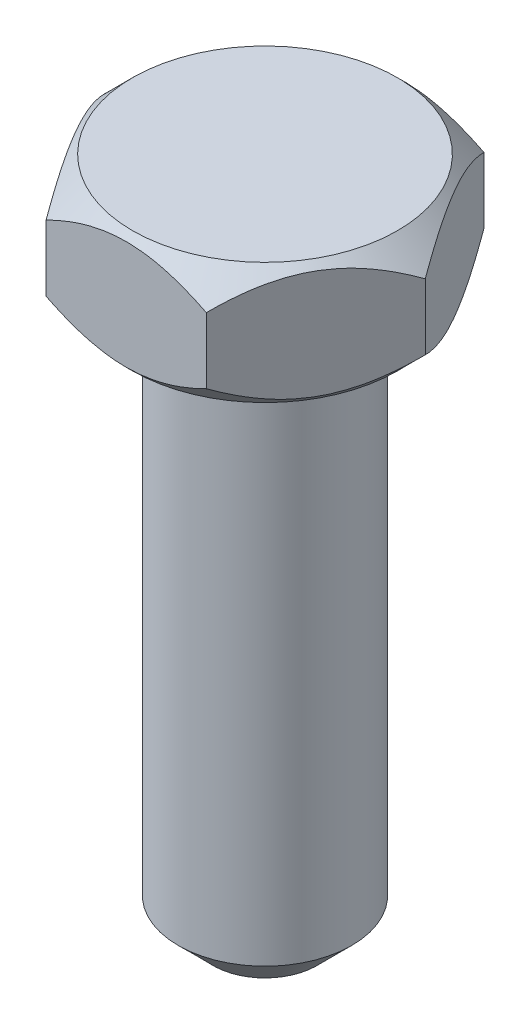
ISO-10303-21;
HEADER;
FILE_DESCRIPTION(('STEP AP214'),'2;1');
FILE_NAME('part.step','',(''),(''),'','','');
FILE_SCHEMA(('AUTOMOTIVE_DESIGN { 1 0 10303 214 1 1 1 1 }'));
ENDSEC;
DATA;
#1=APPLICATION_CONTEXT('core data for automotive mechanical design processes');
#2=APPLICATION_PROTOCOL_DEFINITION('international standard','automotive_design',2000,#1);
#3=PRODUCT_CONTEXT('',#1,'mechanical');
#4=PRODUCT('Part','Part','',(#3));
#5=PRODUCT_RELATED_PRODUCT_CATEGORY('part','',(#4));
#6=PRODUCT_DEFINITION_FORMATION('','',#4);
#7=PRODUCT_DEFINITION_CONTEXT('part definition',#1,'design');
#8=PRODUCT_DEFINITION('design','',#6,#7);
#9=PRODUCT_DEFINITION_SHAPE('','',#8);
#10=(LENGTH_UNIT() NAMED_UNIT(*) SI_UNIT(.MILLI.,.METRE.));
#11=(NAMED_UNIT(*) PLANE_ANGLE_UNIT() SI_UNIT($,.RADIAN.));
#12=(NAMED_UNIT(*) SI_UNIT($,.STERADIAN.) SOLID_ANGLE_UNIT());
#13=UNCERTAINTY_MEASURE_WITH_UNIT(LENGTH_MEASURE(1.E-05),#10,'distance_accuracy_value','');
#14=(GEOMETRIC_REPRESENTATION_CONTEXT(3) GLOBAL_UNCERTAINTY_ASSIGNED_CONTEXT((#13)) GLOBAL_UNIT_ASSIGNED_CONTEXT((#10,
#11,#12)) REPRESENTATION_CONTEXT('',''));
#15=CARTESIAN_POINT('',(0.,0.,0.));
#16=DIRECTION('',(0.,0.,1.));
#17=DIRECTION('',(1.,0.,0.));
#18=AXIS2_PLACEMENT_3D('',#15,#16,#17);
#19=CARTESIAN_POINT('',(-4.61880215351701,-3.5,0.));
#20=DIRECTION('',(0.,1.,0.));
#21=DIRECTION('',(0.,0.,1.));
#22=AXIS2_PLACEMENT_3D('',#19,#20,#21);
#23=PLANE('',#22);
#24=CARTESIAN_POINT('',(0.,-3.5,0.));
#25=DIRECTION('',(0.,1.,0.));
#26=DIRECTION('',(0.,0.,1.));
#27=AXIS2_PLACEMENT_3D('',#24,#25,#26);
#28=CIRCLE('',#27,3.81880215351701);
#29=CARTESIAN_POINT('',(0.,-3.5,3.81880215351701));
#30=VERTEX_POINT('',#29);
#31=EDGE_CURVE('E102',#30,#30,#28,.T.);
#32=ORIENTED_EDGE('',*,*,#31,.F.);
#33=EDGE_LOOP('',(#32));
#34=FACE_BOUND('',#33,.T.);
#35=CARTESIAN_POINT('',(0.,-3.5,0.));
#36=DIRECTION('',(0.,1.,0.));
#37=DIRECTION('',(0.,0.,1.));
#38=AXIS2_PLACEMENT_3D('',#35,#36,#37);
#39=CIRCLE('',#38,2.5);
#40=CARTESIAN_POINT('',(0.,-3.5,2.5));
#41=VERTEX_POINT('',#40);
#42=EDGE_CURVE('E117',#41,#41,#39,.F.);
#43=ORIENTED_EDGE('',*,*,#42,.F.);
#44=EDGE_LOOP('',(#43));
#45=FACE_BOUND('',#44,.T.);
#46=ADVANCED_FACE('F29',(#34,#45),#23,.F.);
#47=CARTESIAN_POINT('',(0.,-19.5,0.));
#48=DIRECTION('',(0.,1.,0.));
#49=DIRECTION('',(0.,0.,1.));
#50=AXIS2_PLACEMENT_3D('',#47,#48,#49);
#51=CYLINDRICAL_SURFACE('',#50,2.5);
#52=CARTESIAN_POINT('',(0.,-18.5,0.));
#53=DIRECTION('',(0.,-1.,0.));
#54=DIRECTION('',(0.,0.,-1.));
#55=AXIS2_PLACEMENT_3D('',#52,#53,#54);
#56=CIRCLE('',#55,2.5);
#57=CARTESIAN_POINT('',(0.,-18.5,-2.5));
#58=VERTEX_POINT('',#57);
#59=EDGE_CURVE('E42',#58,#58,#56,.F.);
#60=ORIENTED_EDGE('',*,*,#59,.T.);
#61=EDGE_LOOP('',(#60));
#62=FACE_BOUND('',#61,.T.);
#63=ORIENTED_EDGE('',*,*,#42,.T.);
#64=EDGE_LOOP('',(#63));
#65=FACE_BOUND('',#64,.T.);
#66=ADVANCED_FACE('F126',(#62,#65),#51,.T.);
#67=CARTESIAN_POINT('',(0.,-19.5,0.));
#68=DIRECTION('',(0.,-1.,0.));
#69=DIRECTION('',(0.,0.,-1.));
#70=AXIS2_PLACEMENT_3D('',#67,#68,#69);
#71=PLANE('',#70);
#72=CARTESIAN_POINT('',(0.,-19.5,0.));
#73=DIRECTION('',(0.,-1.,0.));
#74=DIRECTION('',(0.,0.,-1.));
#75=AXIS2_PLACEMENT_3D('',#72,#73,#74);
#76=CIRCLE('',#75,1.49999999999999);
#77=CARTESIAN_POINT('',(0.,-19.5,-1.49999999999999));
#78=VERTEX_POINT('',#77);
#79=EDGE_CURVE('E120',#78,#78,#76,.T.);
#80=ORIENTED_EDGE('',*,*,#79,.T.);
#81=EDGE_LOOP('',(#80));
#82=FACE_BOUND('',#81,.T.);
#83=ADVANCED_FACE('F132',(#82),#71,.T.);
#84=CARTESIAN_POINT('',(0.,-19.5,0.));
#85=DIRECTION('',(0.,1.,0.));
#86=DIRECTION('',(0.,0.,1.));
#87=AXIS2_PLACEMENT_3D('',#84,#85,#86);
#88=CONICAL_SURFACE('',#87,1.49999999999999,0.785398163397446);
#89=ORIENTED_EDGE('',*,*,#59,.F.);
#90=EDGE_LOOP('',(#89));
#91=FACE_BOUND('',#90,.T.);
#92=ORIENTED_EDGE('',*,*,#79,.F.);
#93=EDGE_LOOP('',(#92));
#94=FACE_BOUND('',#93,.T.);
#95=ADVANCED_FACE('F129',(#91,#94),#88,.T.);
#96=CARTESIAN_POINT('',(0.,-3.5,0.));
#97=DIRECTION('',(0.,1.,0.));
#98=DIRECTION('',(0.,0.,1.));
#99=AXIS2_PLACEMENT_3D('',#96,#97,#98);
#100=CONICAL_SURFACE('',#99,3.81880215351701,0.785398163397448);
#101=CARTESIAN_POINT('',(-4.61891762357085,-2.69988452561614,0.000200000000027756));
#102=CARTESIAN_POINT('',(-4.57920690352857,-2.73959114404244,-0.068580984718356));
#103=CARTESIAN_POINT('',(-4.53919230356692,-2.77807958288685,-0.137888304896475));
#104=CARTESIAN_POINT('',(-4.45849274714728,-2.8522487762645,-0.277664036763568));
#105=CARTESIAN_POINT('',(-4.41780743901014,-2.88792799726836,-0.348133057578679));
#106=CARTESIAN_POINT('',(-4.29427352009149,-2.99049913234901,-0.562100081603879));
#107=CARTESIAN_POINT('',(-4.21037499527408,-3.05248688898744,-0.707416589267722));
#108=CARTESIAN_POINT('',(-4.04121970302445,-3.1586441309906,-1.00040214981323));
#109=CARTESIAN_POINT('',(-3.95600566300933,-3.20308094454657,-1.14799719663762));
#110=CARTESIAN_POINT('',(-3.78369592639709,-3.27155101787056,-1.44644641508885));
#111=CARTESIAN_POINT('',(-3.6966055069617,-3.29563536213871,-1.59729144640342));
#112=CARTESIAN_POINT('',(-3.54650860589272,-3.31736511913948,-1.85726690511355));
#113=CARTESIAN_POINT('',(-3.48369550790706,-3.32058108535916,-1.96606238220551));
#114=CARTESIAN_POINT('',(-3.35817126167379,-3.31515994177501,-2.18347675426331));
#115=CARTESIAN_POINT('',(-3.29546015687919,-3.30651867682818,-2.29209557396634));
#116=CARTESIAN_POINT('',(-3.17063214810082,-3.27787596150358,-2.50830402737814));
#117=CARTESIAN_POINT('',(-3.10851598784037,-3.25786180544875,-2.61589237292032));
#118=CARTESIAN_POINT('',(-2.98535047827865,-3.20756584263536,-2.82922129322133));
#119=CARTESIAN_POINT('',(-2.92430104755975,-3.17728482312165,-2.93496200899963));
#120=CARTESIAN_POINT('',(-2.81592361944285,-3.11498474730579,-3.12267722089175));
#121=CARTESIAN_POINT('',(-2.76835567444983,-3.08460372013991,-3.2050673184313));
#122=CARTESIAN_POINT('',(-2.67407371522763,-3.01894553543967,-3.36836846204128));
#123=CARTESIAN_POINT('',(-2.6273597270248,-2.98366822896023,-3.44927946303275));
#124=CARTESIAN_POINT('',(-2.53493285809128,-2.90900831297909,-3.60936749601013));
#125=CARTESIAN_POINT('',(-2.48921734857499,-2.86963861299641,-3.68854908118623));
#126=CARTESIAN_POINT('',(-2.39863292742736,-2.78731089185671,-3.84544590098815));
#127=CARTESIAN_POINT('',(-2.35376351682289,-2.74435507219806,-3.92316199986076));
#128=CARTESIAN_POINT('',(-2.30928560670467,-2.69988452561615,-4.0002));
#129=B_SPLINE_CURVE_WITH_KNOTS('',3,(#101,#102,#103,#104,#105,#106,#107,#108,#109,#110,#111,
#112,#113,#114,#115,#116,#117,#118,#119,#120,#121,#122,#123,#124,#125,#126,#127,#128),
.UNSPECIFIED.,.F.,.F.,(4,2,2,2,2,2,2,2,2,2,2,2,2,4),(0.,0.266361961703665,0.532868334400115,
1.06875865685463,1.59613884594052,2.12219135055581,2.49866160599659,2.87526382203495,
3.25228760372077,3.62928248242858,3.92874944437162,4.22822551811347,4.52678401907576,
4.82516056577924),.UNSPECIFIED.);
#130=CARTESIAN_POINT('',(-4.61880215351702,-2.7,0.));
#131=VERTEX_POINT('',#130);
#132=CARTESIAN_POINT('',(-2.30940107675852,-2.7,-4.));
#133=VERTEX_POINT('',#132);
#134=EDGE_CURVE('E177',#131,#133,#129,.T.);
#135=ORIENTED_EDGE('',*,*,#134,.T.);
#136=CARTESIAN_POINT('',(-4.74669494328341,-1.11145868915222,-4.));
#137=CARTESIAN_POINT('',(-4.63173073558873,-1.1993508654303,-4.));
#138=CARTESIAN_POINT('',(-4.51613887537967,-1.28643511858206,-4.));
#139=CARTESIAN_POINT('',(-4.28344630120931,-1.45862113364621,-4.));
#140=CARTESIAN_POINT('',(-4.16634522978712,-1.54372241196675,-4.));
#141=CARTESIAN_POINT('',(-3.92952428886011,-1.71218153620796,-4.));
#142=CARTESIAN_POINT('',(-3.80979117395059,-1.79552082328341,-4.));
#143=CARTESIAN_POINT('',(-3.56831834415258,-1.95922999490112,-4.));
#144=CARTESIAN_POINT('',(-3.44657876940923,-2.03960008557233,-4.));
#145=CARTESIAN_POINT('',(-3.19323146896135,-2.20151222850148,-4.));
#146=CARTESIAN_POINT('',(-3.06147610302173,-2.28282442900108,-4.));
#147=CARTESIAN_POINT('',(-2.79487655444763,-2.44030225958758,-4.));
#148=CARTESIAN_POINT('',(-2.6600318671341,-2.51646704063563,-4.));
#149=CARTESIAN_POINT('',(-2.38723344772492,-2.66202065614541,-4.));
#150=CARTESIAN_POINT('',(-2.24929042181595,-2.73142939927244,-4.));
#151=CARTESIAN_POINT('',(-1.96955020070889,-2.86191616592764,-4.));
#152=CARTESIAN_POINT('',(-1.82775483658784,-2.92299806703933,-4.));
#153=CARTESIAN_POINT('',(-1.55337254847197,-3.02945404139103,-4.));
#154=CARTESIAN_POINT('',(-1.4211506740557,-3.07575938281105,-4.));
#155=CARTESIAN_POINT('',(-1.153400475509,-3.15777962167409,-4.));
#156=CARTESIAN_POINT('',(-1.01787193595579,-3.19349382712074,-4.));
#157=CARTESIAN_POINT('',(-0.746641513502644,-3.25182748471192,-4.));
#158=CARTESIAN_POINT('',(-0.610990636137922,-3.27468015045871,-4.));
#159=CARTESIAN_POINT('',(-0.338082766934168,-3.30682458453426,-4.));
#160=CARTESIAN_POINT('',(-0.200826093272512,-3.31611899495528,-4.));
#161=CARTESIAN_POINT('',(0.0682725110831627,-3.32038918600646,-4.));
#162=CARTESIAN_POINT('',(0.200105501326917,-3.31593690851227,-4.));
#163=CARTESIAN_POINT('',(0.462709681486531,-3.29425661019797,-4.));
#164=CARTESIAN_POINT('',(0.593480771402084,-3.27702739994749,-4.));
#165=CARTESIAN_POINT('',(0.855228740743153,-3.23046292068837,-4.));
#166=CARTESIAN_POINT('',(0.986167438767936,-3.20091656435704,-4.));
#167=CARTESIAN_POINT('',(1.24517252052895,-3.13133537173076,-4.));
#168=CARTESIAN_POINT('',(1.37323909358621,-3.09130122897531,-4.));
#169=CARTESIAN_POINT('',(1.6350146777751,-2.99940176499948,-4.));
#170=CARTESIAN_POINT('',(1.76850120421469,-2.94690960373252,-4.));
#171=CARTESIAN_POINT('',(2.03203083305245,-2.83383048639002,-4.));
#172=CARTESIAN_POINT('',(2.16207233412168,-2.77323984239489,-4.));
#173=CARTESIAN_POINT('',(2.41933252641898,-2.64540192173417,-4.));
#174=CARTESIAN_POINT('',(2.54654088208384,-2.57813401413965,-4.));
#175=CARTESIAN_POINT('',(2.79803896567839,-2.43842389721416,-4.));
#176=CARTESIAN_POINT('',(2.9223291435755,-2.36598249266423,-4.));
#177=CARTESIAN_POINT('',(3.16228713945874,-2.22062527401129,-4.));
#178=CARTESIAN_POINT('',(3.27807727928803,-2.14791032425798,-4.));
#179=CARTESIAN_POINT('',(3.5076685919422,-1.99939622591037,-4.));
#180=CARTESIAN_POINT('',(3.62146961421383,-1.92359684529293,-4.));
#181=CARTESIAN_POINT('',(3.84642549416774,-1.77008416558951,-4.));
#182=CARTESIAN_POINT('',(3.95759428564676,-1.69239121161213,-4.));
#183=CARTESIAN_POINT('',(4.17840845706007,-1.53493086471948,-4.));
#184=CARTESIAN_POINT('',(4.28805424827146,-1.4551640492307,-4.));
#185=CARTESIAN_POINT('',(4.39706149639085,-1.37454864251642,-4.));
#186=B_SPLINE_CURVE_WITH_KNOTS('',3,(#136,#137,#138,#139,#140,#141,#142,#143,#144,#145,#146,
#147,#148,#149,#150,#151,#152,#153,#154,#155,#156,#157,#158,#159,#160,#161,#162,#163,#164,#165,
#166,#167,#168,#169,#170,#171,#172,#173,#174,#175,#176,#177,#178,#179,#180,#181,#182,#183,#184,
#185),.UNSPECIFIED.,.F.,.F.,(4,2,2,2,2,2,2,2,2,2,2,2,2,2,2,2,2,2,2,2,2,2,2,2,4),(0.,
0.434146668569334,0.868398128074756,1.30600593465858,1.74358330412151,2.20796839055966,
2.672429888782,3.13547841811301,3.59831057635038,4.01823322720891,4.43818330864351,
4.85025065344053,5.26223768809276,5.65731799923051,6.05243509380702,6.45462166461373,
6.85678164621651,7.28676033389218,7.71693549838636,8.1484838030882,8.57996512242888,
8.9900948031474,9.4002553926905,9.80711077786197,10.2138540702172),.UNSPECIFIED.);
#187=CARTESIAN_POINT('',(2.3094010767585,-2.7,-4.00000000000002));
#188=VERTEX_POINT('',#187);
#189=EDGE_CURVE('E171',#133,#188,#186,.T.);
#190=ORIENTED_EDGE('',*,*,#189,.T.);
#191=CARTESIAN_POINT('',(2.30928560670467,-2.69988452561615,-4.0002));
#192=CARTESIAN_POINT('',(2.34899632674695,-2.73959114404245,-3.93141901528162));
#193=CARTESIAN_POINT('',(2.3890109267086,-2.77807958288686,-3.8621116951035));
#194=CARTESIAN_POINT('',(2.46971048312824,-2.8522487762645,-3.72233596323641));
#195=CARTESIAN_POINT('',(2.51039579126538,-2.88792799726837,-3.6518669424213));
#196=CARTESIAN_POINT('',(2.63392971018403,-2.99049913234902,-3.4378999183961));
#197=CARTESIAN_POINT('',(2.71782823500144,-3.05248688898745,-3.29258341073225));
#198=CARTESIAN_POINT('',(2.88698352725107,-3.15864413099061,-2.99959785018675));
#199=CARTESIAN_POINT('',(2.97219756726618,-3.20308094454657,-2.85200280336236));
#200=CARTESIAN_POINT('',(3.14450730387843,-3.27155101787056,-2.55355358491113));
#201=CARTESIAN_POINT('',(3.23159772331381,-3.29563536213871,-2.40270855359656));
#202=CARTESIAN_POINT('',(3.3816946243828,-3.31736511913948,-2.14273309488644));
#203=CARTESIAN_POINT('',(3.44450772236846,-3.32058108535916,-2.03393761779447));
#204=CARTESIAN_POINT('',(3.57003196860172,-3.31515994177501,-1.81652324573667));
#205=CARTESIAN_POINT('',(3.63274307339633,-3.30651867682818,-1.70790442603365));
#206=CARTESIAN_POINT('',(3.7575710821747,-3.27787596150358,-1.49169597262185));
#207=CARTESIAN_POINT('',(3.81968724243514,-3.25786180544875,-1.38410762707967));
#208=CARTESIAN_POINT('',(3.94285275199687,-3.20756584263536,-1.17077870677866));
#209=CARTESIAN_POINT('',(4.00390218271577,-3.17728482312165,-1.06503799100036));
#210=CARTESIAN_POINT('',(4.11227961083267,-3.11498474730579,-0.877322779108241));
#211=CARTESIAN_POINT('',(4.15984755582569,-3.08460372013991,-0.794932681568691));
#212=CARTESIAN_POINT('',(4.25412951504789,-3.01894553543967,-0.631631537958703));
#213=CARTESIAN_POINT('',(4.30084350325072,-2.98366822896023,-0.550720536967234));
#214=CARTESIAN_POINT('',(4.39327037218424,-2.90900831297908,-0.39063250398986));
#215=CARTESIAN_POINT('',(4.43898588170053,-2.86963861299641,-0.311450918813753));
#216=CARTESIAN_POINT('',(4.52957030284816,-2.78731089185671,-0.154554099011833));
#217=CARTESIAN_POINT('',(4.57443971345263,-2.74435507219805,-0.0768380001392213));
#218=CARTESIAN_POINT('',(4.61891762357085,-2.69988452561614,0.000200000000015641));
#219=B_SPLINE_CURVE_WITH_KNOTS('',3,(#191,#192,#193,#194,#195,#196,#197,#198,#199,#200,#201,
#202,#203,#204,#205,#206,#207,#208,#209,#210,#211,#212,#213,#214,#215,#216,#217,#218),
.UNSPECIFIED.,.F.,.F.,(4,2,2,2,2,2,2,2,2,2,2,2,2,4),(0.,0.266361961703664,0.532868334400111,
1.06875865685462,1.5961388459405,2.1221913505558,2.49866160599657,2.87526382203494,
3.25228760372076,3.62928248242857,3.92874944437161,4.22822551811345,4.52678401907575,
4.82516056577923),.UNSPECIFIED.);
#220=CARTESIAN_POINT('',(4.61880215351701,-2.7,0.));
#221=VERTEX_POINT('',#220);
#222=EDGE_CURVE('E90',#188,#221,#219,.T.);
#223=ORIENTED_EDGE('',*,*,#222,.T.);
#224=CARTESIAN_POINT('',(4.61891762357085,-2.69988452561614,-0.000199999999985046));
#225=CARTESIAN_POINT('',(4.57920690352856,-2.73959114404244,0.0685809847183984));
#226=CARTESIAN_POINT('',(4.53919230356692,-2.77807958288685,0.137888304896517));
#227=CARTESIAN_POINT('',(4.45849274714727,-2.8522487762645,0.277664036763609));
#228=CARTESIAN_POINT('',(4.41780743901014,-2.88792799726836,0.34813305757872));
#229=CARTESIAN_POINT('',(4.29427352009149,-2.99049913234901,0.562100081603918));
#230=CARTESIAN_POINT('',(4.21037499527407,-3.05248688898745,0.707416589267761));
#231=CARTESIAN_POINT('',(4.04121970302444,-3.15864413099061,1.00040214981327));
#232=CARTESIAN_POINT('',(3.95600566300932,-3.20308094454657,1.14799719663766));
#233=CARTESIAN_POINT('',(3.78369592639707,-3.27155101787056,1.44644641508888));
#234=CARTESIAN_POINT('',(3.69660550696169,-3.29563536213871,1.59729144640345));
#235=CARTESIAN_POINT('',(3.5465086058927,-3.31736511913948,1.85726690511358));
#236=CARTESIAN_POINT('',(3.48369550790704,-3.32058108535916,1.96606238220554));
#237=CARTESIAN_POINT('',(3.35817126167377,-3.31515994177501,2.18347675426334));
#238=CARTESIAN_POINT('',(3.29546015687917,-3.30651867682818,2.29209557396637));
#239=CARTESIAN_POINT('',(3.1706321481008,-3.27787596150358,2.50830402737817));
#240=CARTESIAN_POINT('',(3.10851598784035,-3.25786180544875,2.61589237292034));
#241=CARTESIAN_POINT('',(2.98535047827863,-3.20756584263536,2.82922129322135));
#242=CARTESIAN_POINT('',(2.92430104755973,-3.17728482312165,2.93496200899965));
#243=CARTESIAN_POINT('',(2.81592361944282,-3.11498474730579,3.12267722089177));
#244=CARTESIAN_POINT('',(2.76835567444981,-3.08460372013991,3.20506731843132));
#245=CARTESIAN_POINT('',(2.67407371522761,-3.01894553543968,3.3683684620413));
#246=CARTESIAN_POINT('',(2.62735972702478,-2.98366822896024,3.44927946303277));
#247=CARTESIAN_POINT('',(2.53493285809126,-2.90900831297909,3.60936749601014));
#248=CARTESIAN_POINT('',(2.48921734857497,-2.86963861299642,3.68854908118624));
#249=CARTESIAN_POINT('',(2.39863292742734,-2.78731089185672,3.84544590098816));
#250=CARTESIAN_POINT('',(2.35376351682287,-2.74435507219807,3.92316199986077));
#251=CARTESIAN_POINT('',(2.30928560670465,-2.69988452561616,4.0002));
#252=B_SPLINE_CURVE_WITH_KNOTS('',3,(#224,#225,#226,#227,#228,#229,#230,#231,#232,#233,#234,
#235,#236,#237,#238,#239,#240,#241,#242,#243,#244,#245,#246,#247,#248,#249,#250,#251),
.UNSPECIFIED.,.F.,.F.,(4,2,2,2,2,2,2,2,2,2,2,2,2,4),(0.,0.266361961703665,0.532868334400114,
1.06875865685463,1.59613884594051,2.12219135055581,2.49866160599659,2.87526382203495,
3.25228760372077,3.62928248242858,3.92874944437161,4.22822551811345,4.52678401907573,
4.82516056577921),.UNSPECIFIED.);
#253=CARTESIAN_POINT('',(2.30940107675852,-2.7,4.));
#254=VERTEX_POINT('',#253);
#255=EDGE_CURVE('E86',#221,#254,#252,.T.);
#256=ORIENTED_EDGE('',*,*,#255,.T.);
#257=CARTESIAN_POINT('',(-4.74669494331183,-1.11145868913049,4.));
#258=CARTESIAN_POINT('',(-4.63173073561633,-1.19935086540941,4.));
#259=CARTESIAN_POINT('',(-4.51613887540645,-1.28643511856201,4.));
#260=CARTESIAN_POINT('',(-4.28344630123446,-1.45862113362783,4.));
#261=CARTESIAN_POINT('',(-4.16634522981144,-1.5437224119492,4.));
#262=CARTESIAN_POINT('',(-3.92952428888276,-1.71218153619209,4.));
#263=CARTESIAN_POINT('',(-3.80979117397239,-1.79552082326838,4.));
#264=CARTESIAN_POINT('',(-3.56831834417267,-1.95922999488776,4.));
#265=CARTESIAN_POINT('',(-3.44657876942845,-2.03960008555979,4.));
#266=CARTESIAN_POINT('',(-3.1932314689787,-2.20151222849066,4.));
#267=CARTESIAN_POINT('',(-3.06147610303807,-2.28282442899116,4.));
#268=CARTESIAN_POINT('',(-2.79487655446192,-2.4403022595794,4.));
#269=CARTESIAN_POINT('',(-2.66003186714736,-2.51646704062831,4.));
#270=CARTESIAN_POINT('',(-2.38723344773605,-2.66202065613972,4.));
#271=CARTESIAN_POINT('',(-2.24929042182601,-2.73142939926754,4.));
#272=CARTESIAN_POINT('',(-1.96955020071673,-2.8619161659242,4.));
#273=CARTESIAN_POINT('',(-1.82775483659454,-2.92299806703658,4.));
#274=CARTESIAN_POINT('',(-1.55337254847819,-3.02945404138876,4.));
#275=CARTESIAN_POINT('',(-1.42115067406264,-3.07575938280871,4.));
#276=CARTESIAN_POINT('',(-1.15340047551737,-3.15777962167175,4.));
#277=CARTESIAN_POINT('',(-1.0178719359649,-3.19349382711846,4.));
#278=CARTESIAN_POINT('',(-0.7466415135132,-3.25182748470995,4.));
#279=CARTESIAN_POINT('',(-0.610990636149189,-3.27468015045698,4.));
#280=CARTESIAN_POINT('',(-0.338082766946836,-3.30682458453317,4.));
#281=CARTESIAN_POINT('',(-0.200826093285872,-3.31611899495459,4.));
#282=CARTESIAN_POINT('',(0.0682725110685937,-3.32038918600669,4.));
#283=CARTESIAN_POINT('',(0.200105501311828,-3.31593690851301,4.));
#284=CARTESIAN_POINT('',(0.462709681470457,-3.29425661019981,4.));
#285=CARTESIAN_POINT('',(0.593480771385546,-3.27702739994991,4.));
#286=CARTESIAN_POINT('',(0.855228740725698,-3.230462920692,4.));
#287=CARTESIAN_POINT('',(0.986167438750031,-3.20091656436132,4.));
#288=CARTESIAN_POINT('',(1.24517252051019,-3.13133537173633,4.));
#289=CARTESIAN_POINT('',(1.37323909356705,-3.09130122898153,4.));
#290=CARTESIAN_POINT('',(1.63501467775369,-2.99940176500754,4.));
#291=CARTESIAN_POINT('',(1.76850120419148,-2.94690960374188,4.));
#292=CARTESIAN_POINT('',(2.03203083302572,-2.8338304864021,4.));
#293=CARTESIAN_POINT('',(2.16207233409324,-2.77323984240839,4.));
#294=CARTESIAN_POINT('',(2.41933252638718,-2.6454019217506,4.));
#295=CARTESIAN_POINT('',(2.54654088205039,-2.5781340141576,4.));
#296=CARTESIAN_POINT('',(2.79803896564169,-2.43842389723518,4.));
#297=CARTESIAN_POINT('',(2.92232914353721,-2.3659824926868,4.));
#298=CARTESIAN_POINT('',(3.16228713941755,-2.22062527403683,4.));
#299=CARTESIAN_POINT('',(3.27807727924554,-2.14791032428491,4.));
#300=CARTESIAN_POINT('',(3.50766859189711,-1.99939622594009,4.));
#301=CARTESIAN_POINT('',(3.62146961416746,-1.92359684532405,4.));
#302=CARTESIAN_POINT('',(3.84642549411882,-1.77008416562341,4.));
#303=CARTESIAN_POINT('',(3.95759428559658,-1.69239121164742,4.));
#304=CARTESIAN_POINT('',(4.17840845700739,-1.53493086475754,4.));
#305=CARTESIAN_POINT('',(4.28805424821753,-1.45516404927014,4.));
#306=CARTESIAN_POINT('',(4.39706149633567,-1.37454864255723,4.));
#307=B_SPLINE_CURVE_WITH_KNOTS('',3,(#257,#258,#259,#260,#261,#262,#263,#264,#265,#266,#267,
#268,#269,#270,#271,#272,#273,#274,#275,#276,#277,#278,#279,#280,#281,#282,#283,#284,#285,#286,
#287,#288,#289,#290,#291,#292,#293,#294,#295,#296,#297,#298,#299,#300,#301,#302,#303,#304,#305,
#306),.UNSPECIFIED.,.F.,.F.,(4,2,2,2,2,2,2,2,2,2,2,2,2,2,2,2,2,2,2,2,2,2,2,2,4),(0.,
0.434146668572803,0.868398128081697,1.30600593466906,1.74358330413552,2.20796839057765,
2.67242988880396,3.13547841813892,3.59831057638022,4.01823322723668,4.43818330866922,
4.85025065346426,5.26223768811452,5.65731799925067,6.05243509382556,6.45462166463053,
6.85678164623158,7.2867603339008,7.71693549838852,8.14848380308387,8.57996512241806,
8.99009480313104,9.40025539266859,9.80711077783459,10.2138540701843),.UNSPECIFIED.);
#308=CARTESIAN_POINT('',(-2.30940107675848,-2.70000000000002,4.));
#309=VERTEX_POINT('',#308);
#310=EDGE_CURVE('E48',#254,#309,#307,.F.);
#311=ORIENTED_EDGE('',*,*,#310,.T.);
#312=CARTESIAN_POINT('',(-2.30928560670464,-2.69988452561616,4.0002));
#313=CARTESIAN_POINT('',(-2.34899632674693,-2.73959114404246,3.93141901528162));
#314=CARTESIAN_POINT('',(-2.38901092670858,-2.77807958288687,3.8621116951035));
#315=CARTESIAN_POINT('',(-2.46971048312822,-2.85224877626451,3.72233596323641));
#316=CARTESIAN_POINT('',(-2.51039579126535,-2.88792799726838,3.6518669424213));
#317=CARTESIAN_POINT('',(-2.633929710184,-2.99049913234903,3.43789991839611));
#318=CARTESIAN_POINT('',(-2.71782823500142,-3.05248688898745,3.29258341073227));
#319=CARTESIAN_POINT('',(-2.88698352725104,-3.15864413099061,2.99959785018676));
#320=CARTESIAN_POINT('',(-2.97219756726616,-3.20308094454658,2.85200280336238));
#321=CARTESIAN_POINT('',(-3.14450730387841,-3.27155101787057,2.55355358491116));
#322=CARTESIAN_POINT('',(-3.23159772331379,-3.29563536213871,2.40270855359659));
#323=CARTESIAN_POINT('',(-3.38169462438278,-3.31736511913948,2.14273309488647));
#324=CARTESIAN_POINT('',(-3.44450772236844,-3.32058108535916,2.0339376177945));
#325=CARTESIAN_POINT('',(-3.57003196860171,-3.31515994177501,1.81652324573671));
#326=CARTESIAN_POINT('',(-3.63274307339631,-3.30651867682818,1.70790442603368));
#327=CARTESIAN_POINT('',(-3.75757108217469,-3.27787596150358,1.49169597262188));
#328=CARTESIAN_POINT('',(-3.81968724243513,-3.25786180544875,1.3841076270797));
#329=CARTESIAN_POINT('',(-3.94285275199685,-3.20756584263536,1.1707787067787));
#330=CARTESIAN_POINT('',(-4.00390218271576,-3.17728482312165,1.0650379910004));
#331=CARTESIAN_POINT('',(-4.11227961083266,-3.11498474730579,0.877322779108279));
#332=CARTESIAN_POINT('',(-4.15984755582568,-3.08460372013991,0.794932681568729));
#333=CARTESIAN_POINT('',(-4.25412951504789,-3.01894553543967,0.631631537958742));
#334=CARTESIAN_POINT('',(-4.30084350325071,-2.98366822896023,0.550720536967273));
#335=CARTESIAN_POINT('',(-4.39327037218424,-2.90900831297908,0.3906325039899));
#336=CARTESIAN_POINT('',(-4.43898588170053,-2.86963861299641,0.311450918813793));
#337=CARTESIAN_POINT('',(-4.52957030284816,-2.78731089185671,0.154554099011874));
#338=CARTESIAN_POINT('',(-4.57443971345263,-2.74435507219805,0.0768380001392636));
#339=CARTESIAN_POINT('',(-4.61891762357085,-2.69988452561614,-0.000199999999972631));
#340=B_SPLINE_CURVE_WITH_KNOTS('',3,(#312,#313,#314,#315,#316,#317,#318,#319,#320,#321,#322,
#323,#324,#325,#326,#327,#328,#329,#330,#331,#332,#333,#334,#335,#336,#337,#338,#339),
.UNSPECIFIED.,.F.,.F.,(4,2,2,2,2,2,2,2,2,2,2,2,2,4),(0.,0.26636196170366,0.532868334400105,
1.06875865685461,1.59613884594049,2.12219135055577,2.49866160599655,2.87526382203491,
3.25228760372073,3.62928248242854,3.92874944437158,4.22822551811343,4.52678401907572,
4.82516056577921),.UNSPECIFIED.);
#341=EDGE_CURVE('E11',#309,#131,#340,.T.);
#342=ORIENTED_EDGE('',*,*,#341,.T.);
#343=EDGE_LOOP('',(#135,#190,#223,#256,#311,#342));
#344=FACE_BOUND('',#343,.T.);
#345=ORIENTED_EDGE('',*,*,#31,.T.);
#346=EDGE_LOOP('',(#345));
#347=FACE_BOUND('',#346,.T.);
#348=ADVANCED_FACE('F87',(#344,#347),#100,.T.);
#349=CARTESIAN_POINT('',(-4.61880215351701,0.,0.));
#350=DIRECTION('',(0.,1.,0.));
#351=DIRECTION('',(0.,0.,1.));
#352=AXIS2_PLACEMENT_3D('',#349,#350,#351);
#353=PLANE('',#352);
#354=CARTESIAN_POINT('',(0.,0.,0.));
#355=DIRECTION('',(0.,1.,0.));
#356=DIRECTION('',(0.,0.,1.));
#357=AXIS2_PLACEMENT_3D('',#354,#355,#356);
#358=CIRCLE('',#357,3.81880215351701);
#359=CARTESIAN_POINT('',(0.,0.,3.81880215351701));
#360=VERTEX_POINT('',#359);
#361=EDGE_CURVE('E234',#360,#360,#358,.T.);
#362=ORIENTED_EDGE('',*,*,#361,.T.);
#363=EDGE_LOOP('',(#362));
#364=FACE_BOUND('',#363,.T.);
#365=ADVANCED_FACE('F152',(#364),#353,.T.);
#366=CARTESIAN_POINT('',(0.,-0.8,0.));
#367=DIRECTION('',(0.,-1.,0.));
#368=DIRECTION('',(0.,0.,-1.));
#369=AXIS2_PLACEMENT_3D('',#366,#367,#368);
#370=CONICAL_SURFACE('',#369,4.61880215351701,0.785398163397448);
#371=CARTESIAN_POINT('',(-2.30928560670467,-0.80011547438385,-4.0002));
#372=CARTESIAN_POINT('',(-2.34899632674696,-0.76040885595755,-3.93141901528162));
#373=CARTESIAN_POINT('',(-2.3890109267086,-0.721920417113141,-3.8621116951035));
#374=CARTESIAN_POINT('',(-2.46971048312825,-0.647751223735498,-3.72233596323641));
#375=CARTESIAN_POINT('',(-2.51039579126538,-0.612072002731633,-3.65186694242129));
#376=CARTESIAN_POINT('',(-2.63392971018403,-0.509500867650983,-3.4378999183961));
#377=CARTESIAN_POINT('',(-2.71782823500145,-0.447513111012552,-3.29258341073225));
#378=CARTESIAN_POINT('',(-2.88698352725107,-0.341355869009392,-2.99959785018674));
#379=CARTESIAN_POINT('',(-2.97219756726619,-0.296919055453425,-2.85200280336235));
#380=CARTESIAN_POINT('',(-3.14450730387843,-0.228448982129436,-2.55355358491113));
#381=CARTESIAN_POINT('',(-3.23159772331382,-0.204364637861294,-2.40270855359656));
#382=CARTESIAN_POINT('',(-3.3816946243828,-0.182634880860519,-2.14273309488643));
#383=CARTESIAN_POINT('',(-3.44450772236846,-0.179418914640843,-2.03393761779447));
#384=CARTESIAN_POINT('',(-3.57003196860173,-0.184840058224988,-1.81652324573667));
#385=CARTESIAN_POINT('',(-3.63274307339633,-0.193481323171816,-1.70790442603364));
#386=CARTESIAN_POINT('',(-3.7575710821747,-0.222124038496419,-1.49169597262184));
#387=CARTESIAN_POINT('',(-3.81968724243515,-0.24213819455125,-1.38410762707966));
#388=CARTESIAN_POINT('',(-3.94285275199687,-0.292434157364639,-1.17077870677865));
#389=CARTESIAN_POINT('',(-4.00390218271577,-0.322715176878353,-1.06503799100035));
#390=CARTESIAN_POINT('',(-4.11227961083267,-0.385015252694212,-0.877322779108234));
#391=CARTESIAN_POINT('',(-4.15984755582569,-0.415396279860092,-0.794932681568683));
#392=CARTESIAN_POINT('',(-4.25412951504789,-0.481054464560328,-0.631631537958694));
#393=CARTESIAN_POINT('',(-4.30084350325072,-0.516331771039769,-0.550720536967224));
#394=CARTESIAN_POINT('',(-4.39327037218424,-0.590991687020916,-0.390632503989849));
#395=CARTESIAN_POINT('',(-4.43898588170053,-0.630361387003592,-0.311450918813742));
#396=CARTESIAN_POINT('',(-4.52957030284816,-0.712689108143292,-0.154554099011821));
#397=CARTESIAN_POINT('',(-4.57443971345263,-0.75564492780195,-0.0768380001392092));
#398=CARTESIAN_POINT('',(-4.61891762357085,-0.800115474383857,0.00020000000002798));
#399=B_SPLINE_CURVE_WITH_KNOTS('',3,(#371,#372,#373,#374,#375,#376,#377,#378,#379,#380,#381,
#382,#383,#384,#385,#386,#387,#388,#389,#390,#391,#392,#393,#394,#395,#396,#397,#398),
.UNSPECIFIED.,.F.,.F.,(4,2,2,2,2,2,2,2,2,2,2,2,2,4),(0.,0.266361961703663,0.532868334400112,
1.06875865685462,1.59613884594051,2.1221913505558,2.49866160599658,2.87526382203494,
3.25228760372076,3.62928248242857,3.92874944437161,4.22822551811346,4.52678401907576,
4.82516056577924),.UNSPECIFIED.);
#400=CARTESIAN_POINT('',(-2.30940107675852,-0.8,-4.));
#401=VERTEX_POINT('',#400);
#402=CARTESIAN_POINT('',(-4.61880215351701,-0.8,0.));
#403=VERTEX_POINT('',#402);
#404=EDGE_CURVE('E116',#401,#403,#399,.T.);
#405=ORIENTED_EDGE('',*,*,#404,.T.);
#406=CARTESIAN_POINT('',(-4.61891762357085,-0.800115474383857,-0.000199999999972244));
#407=CARTESIAN_POINT('',(-4.57920690352857,-0.760408855957556,0.0685809847184112));
#408=CARTESIAN_POINT('',(-4.53919230356692,-0.721920417113147,0.137888304896529));
#409=CARTESIAN_POINT('',(-4.45849274714727,-0.647751223735503,0.277664036763622));
#410=CARTESIAN_POINT('',(-4.41780743901014,-0.612072002731638,0.348133057578733));
#411=CARTESIAN_POINT('',(-4.29427352009148,-0.509500867650987,0.562100081603931));
#412=CARTESIAN_POINT('',(-4.21037499527407,-0.447513111012555,0.707416589267774));
#413=CARTESIAN_POINT('',(-4.04121970302444,-0.341355869009395,1.00040214981328));
#414=CARTESIAN_POINT('',(-3.95600566300932,-0.296919055453428,1.14799719663767));
#415=CARTESIAN_POINT('',(-3.78369592639707,-0.228448982129437,1.4464464150889));
#416=CARTESIAN_POINT('',(-3.69660550696168,-0.204364637861293,1.59729144640347));
#417=CARTESIAN_POINT('',(-3.54650860589269,-0.182634880860519,1.85726690511359));
#418=CARTESIAN_POINT('',(-3.48369550790703,-0.179418914640844,1.96606238220556));
#419=CARTESIAN_POINT('',(-3.35817126167376,-0.184840058224989,2.18347675426336));
#420=CARTESIAN_POINT('',(-3.29546015687916,-0.193481323171817,2.29209557396638));
#421=CARTESIAN_POINT('',(-3.17063214810078,-0.222124038496419,2.50830402737818));
#422=CARTESIAN_POINT('',(-3.10851598784034,-0.242138194551251,2.61589237292036));
#423=CARTESIAN_POINT('',(-2.98535047827862,-0.29243415736464,2.82922129322137));
#424=CARTESIAN_POINT('',(-2.92430104755971,-0.322715176878354,2.93496200899967));
#425=CARTESIAN_POINT('',(-2.81592361944281,-0.385015252694212,3.12267722089178));
#426=CARTESIAN_POINT('',(-2.76835567444979,-0.415396279860091,3.20506731843133));
#427=CARTESIAN_POINT('',(-2.67407371522759,-0.481054464560324,3.36836846204131));
#428=CARTESIAN_POINT('',(-2.62735972702477,-0.516331771039763,3.44927946303277));
#429=CARTESIAN_POINT('',(-2.53493285809125,-0.590991687020907,3.60936749601014));
#430=CARTESIAN_POINT('',(-2.48921734857496,-0.630361387003581,3.68854908118625));
#431=CARTESIAN_POINT('',(-2.39863292742733,-0.712689108143276,3.84544590098816));
#432=CARTESIAN_POINT('',(-2.35376351682286,-0.755644927801931,3.92316199986077));
#433=CARTESIAN_POINT('',(-2.30928560670464,-0.800115474383836,4.0002));
#434=B_SPLINE_CURVE_WITH_KNOTS('',3,(#406,#407,#408,#409,#410,#411,#412,#413,#414,#415,#416,
#417,#418,#419,#420,#421,#422,#423,#424,#425,#426,#427,#428,#429,#430,#431,#432,#433),
.UNSPECIFIED.,.F.,.F.,(4,2,2,2,2,2,2,2,2,2,2,2,2,4),(0.,0.266361961703666,0.532868334400115,
1.06875865685463,1.59613884594052,2.12219135055582,2.49866160599659,2.87526382203496,
3.25228760372078,3.62928248242859,3.92874944437162,4.22822551811345,4.52678401907573,
4.82516056577921),.UNSPECIFIED.);
#435=CARTESIAN_POINT('',(-2.30940107675846,-0.8,4.00000000000004));
#436=VERTEX_POINT('',#435);
#437=EDGE_CURVE('E237',#403,#436,#434,.T.);
#438=ORIENTED_EDGE('',*,*,#437,.T.);
#439=CARTESIAN_POINT('',(-4.74669494331183,-2.38854131086951,4.));
#440=CARTESIAN_POINT('',(-4.63173073561633,-2.30064913459059,4.));
#441=CARTESIAN_POINT('',(-4.51613887540645,-2.21356488143799,4.));
#442=CARTESIAN_POINT('',(-4.28344630123446,-2.04137886637217,4.));
#443=CARTESIAN_POINT('',(-4.16634522981144,-1.9562775880508,4.));
#444=CARTESIAN_POINT('',(-3.92952428888276,-1.78781846380791,4.));
#445=CARTESIAN_POINT('',(-3.80979117397239,-1.70447917673162,4.));
#446=CARTESIAN_POINT('',(-3.56831834417267,-1.54077000511224,4.));
#447=CARTESIAN_POINT('',(-3.44657876942845,-1.4603999144402,4.));
#448=CARTESIAN_POINT('',(-3.1932314689787,-1.29848777150934,4.));
#449=CARTESIAN_POINT('',(-3.06147610303807,-1.21717557100884,4.));
#450=CARTESIAN_POINT('',(-2.79487655446192,-1.0596977404206,4.));
#451=CARTESIAN_POINT('',(-2.66003186714736,-0.983532959371693,4.));
#452=CARTESIAN_POINT('',(-2.38723344773605,-0.83797934386028,4.));
#453=CARTESIAN_POINT('',(-2.24929042182601,-0.768570600732463,4.));
#454=CARTESIAN_POINT('',(-1.96955020071673,-0.638083834075798,4.));
#455=CARTESIAN_POINT('',(-1.82775483659454,-0.577001932963423,4.));
#456=CARTESIAN_POINT('',(-1.55337254847819,-0.470545958611243,4.));
#457=CARTESIAN_POINT('',(-1.42115067406264,-0.424240617191292,4.));
#458=CARTESIAN_POINT('',(-1.15340047551737,-0.342220378328252,4.));
#459=CARTESIAN_POINT('',(-1.0178719359649,-0.306506172881536,4.));
#460=CARTESIAN_POINT('',(-0.7466415135132,-0.248172515290046,4.));
#461=CARTESIAN_POINT('',(-0.610990636149189,-0.225319849543021,4.));
#462=CARTESIAN_POINT('',(-0.338082766946836,-0.193175415466834,4.));
#463=CARTESIAN_POINT('',(-0.200826093285872,-0.18388100504541,4.));
#464=CARTESIAN_POINT('',(0.0682725110685938,-0.179610813993308,4.));
#465=CARTESIAN_POINT('',(0.200105501311828,-0.184063091486993,4.));
#466=CARTESIAN_POINT('',(0.462709681470458,-0.205743389800194,4.));
#467=CARTESIAN_POINT('',(0.593480771385547,-0.222972600050089,4.));
#468=CARTESIAN_POINT('',(0.855228740725699,-0.269537079307995,4.));
#469=CARTESIAN_POINT('',(0.986167438750031,-0.299083435638683,4.));
#470=CARTESIAN_POINT('',(1.24517252051019,-0.368664628263667,4.));
#471=CARTESIAN_POINT('',(1.37323909356705,-0.40869877101847,4.));
#472=CARTESIAN_POINT('',(1.63501467775369,-0.500598234992463,4.));
#473=CARTESIAN_POINT('',(1.76850120419148,-0.553090396258124,4.));
#474=CARTESIAN_POINT('',(2.03203083302572,-0.666169513597902,4.));
#475=CARTESIAN_POINT('',(2.16207233409324,-0.72676015759161,4.));
#476=CARTESIAN_POINT('',(2.41933252638718,-0.854598078249394,4.));
#477=CARTESIAN_POINT('',(2.54654088205039,-0.921865985842403,4.));
#478=CARTESIAN_POINT('',(2.79803896564169,-1.06157610276482,4.));
#479=CARTESIAN_POINT('',(2.92232914353721,-1.1340175073132,4.));
#480=CARTESIAN_POINT('',(3.16228713941755,-1.27937472596317,4.));
#481=CARTESIAN_POINT('',(3.27807727924553,-1.35208967571509,4.));
#482=CARTESIAN_POINT('',(3.50766859189711,-1.5006037740599,4.));
#483=CARTESIAN_POINT('',(3.62146961416745,-1.57640315467594,4.));
#484=CARTESIAN_POINT('',(3.84642549411882,-1.72991583437659,4.));
#485=CARTESIAN_POINT('',(3.95759428559658,-1.80760878835258,4.));
#486=CARTESIAN_POINT('',(4.17840845700739,-1.96506913524246,4.));
#487=CARTESIAN_POINT('',(4.28805424821752,-2.04483595072986,4.));
#488=CARTESIAN_POINT('',(4.39706149633567,-2.12545135744276,4.));
#489=B_SPLINE_CURVE_WITH_KNOTS('',3,(#439,#440,#441,#442,#443,#444,#445,#446,#447,#448,#449,
#450,#451,#452,#453,#454,#455,#456,#457,#458,#459,#460,#461,#462,#463,#464,#465,#466,#467,#468,
#469,#470,#471,#472,#473,#474,#475,#476,#477,#478,#479,#480,#481,#482,#483,#484,#485,#486,#487,
#488),.UNSPECIFIED.,.F.,.F.,(4,2,2,2,2,2,2,2,2,2,2,2,2,2,2,2,2,2,2,2,2,2,2,2,4),(0.,
0.434146668572803,0.868398128081697,1.30600593466906,1.74358330413553,2.20796839057765,
2.67242988880397,3.13547841813892,3.59831057638022,4.01823322723668,4.43818330866922,
4.85025065346426,5.26223768811452,5.65731799925067,6.05243509382556,6.45462166463053,
6.85678164623157,7.2867603339008,7.71693549838852,8.14848380308387,8.57996512241806,
8.99009480313104,9.40025539266859,9.80711077783459,10.2138540701843),.UNSPECIFIED.);
#490=CARTESIAN_POINT('',(2.30940107675852,-0.8,4.));
#491=VERTEX_POINT('',#490);
#492=EDGE_CURVE('E211',#436,#491,#489,.T.);
#493=ORIENTED_EDGE('',*,*,#492,.T.);
#494=CARTESIAN_POINT('',(2.30928560670465,-0.80011547438384,4.0002));
#495=CARTESIAN_POINT('',(2.34899632674694,-0.760408855957541,3.93141901528162));
#496=CARTESIAN_POINT('',(2.38901092670859,-0.721920417113134,3.8621116951035));
#497=CARTESIAN_POINT('',(2.46971048312823,-0.647751223735491,3.72233596323641));
#498=CARTESIAN_POINT('',(2.51039579126536,-0.612072002731627,3.6518669424213));
#499=CARTESIAN_POINT('',(2.63392971018401,-0.509500867650978,3.4378999183961));
#500=CARTESIAN_POINT('',(2.71782823500143,-0.447513111012549,3.29258341073226));
#501=CARTESIAN_POINT('',(2.88698352725105,-0.341355869009391,2.99959785018676));
#502=CARTESIAN_POINT('',(2.97219756726617,-0.296919055453424,2.85200280336237));
#503=CARTESIAN_POINT('',(3.14450730387842,-0.228448982129436,2.55355358491115));
#504=CARTESIAN_POINT('',(3.2315977233138,-0.204364637861294,2.40270855359658));
#505=CARTESIAN_POINT('',(3.38169462438279,-0.18263488086052,2.14273309488646));
#506=CARTESIAN_POINT('',(3.44450772236845,-0.179418914640844,2.03393761779449));
#507=CARTESIAN_POINT('',(3.57003196860172,-0.18484005822499,1.81652324573669));
#508=CARTESIAN_POINT('',(3.63274307339632,-0.193481323171818,1.70790442603367));
#509=CARTESIAN_POINT('',(3.7575710821747,-0.22212403849642,1.49169597262187));
#510=CARTESIAN_POINT('',(3.81968724243514,-0.242138194551252,1.38410762707969));
#511=CARTESIAN_POINT('',(3.94285275199686,-0.292434157364641,1.17077870677868));
#512=CARTESIAN_POINT('',(4.00390218271576,-0.322715176878355,1.06503799100038));
#513=CARTESIAN_POINT('',(4.11227961083267,-0.385015252694214,0.877322779108265));
#514=CARTESIAN_POINT('',(4.15984755582569,-0.415396279860094,0.794932681568716));
#515=CARTESIAN_POINT('',(4.25412951504789,-0.48105446456033,0.631631537958729));
#516=CARTESIAN_POINT('',(4.30084350325072,-0.51633177103977,0.55072053696726));
#517=CARTESIAN_POINT('',(4.39327037218424,-0.590991687020917,0.390632503989887));
#518=CARTESIAN_POINT('',(4.43898588170053,-0.630361387003592,0.311450918813781));
#519=CARTESIAN_POINT('',(4.52957030284816,-0.712689108143291,0.154554099011862));
#520=CARTESIAN_POINT('',(4.57443971345263,-0.755644927801949,0.0768380001392509));
#521=CARTESIAN_POINT('',(4.61891762357085,-0.800115474383855,-0.000199999999985036));
#522=B_SPLINE_CURVE_WITH_KNOTS('',3,(#494,#495,#496,#497,#498,#499,#500,#501,#502,#503,#504,
#505,#506,#507,#508,#509,#510,#511,#512,#513,#514,#515,#516,#517,#518,#519,#520,#521),
.UNSPECIFIED.,.F.,.F.,(4,2,2,2,2,2,2,2,2,2,2,2,2,4),(0.,0.266361961703662,0.532868334400107,
1.06875865685461,1.59613884594049,2.12219135055578,2.49866160599656,2.87526382203492,
3.25228760372074,3.62928248242855,3.92874944437159,4.22822551811343,4.52678401907573,
4.82516056577921),.UNSPECIFIED.);
#523=CARTESIAN_POINT('',(4.61880215351701,-0.8,0.));
#524=VERTEX_POINT('',#523);
#525=EDGE_CURVE('E107',#491,#524,#522,.T.);
#526=ORIENTED_EDGE('',*,*,#525,.T.);
#527=CARTESIAN_POINT('',(4.61891762357085,-0.800115474383856,0.000200000000015093));
#528=CARTESIAN_POINT('',(4.57920690352857,-0.760408855957555,-0.0685809847183687));
#529=CARTESIAN_POINT('',(4.53919230356692,-0.721920417113146,-0.137888304896487));
#530=CARTESIAN_POINT('',(4.45849274714727,-0.647751223735502,-0.27766403676358));
#531=CARTESIAN_POINT('',(4.41780743901014,-0.612072002731637,-0.348133057578692));
#532=CARTESIAN_POINT('',(4.29427352009149,-0.509500867650986,-0.562100081603891));
#533=CARTESIAN_POINT('',(4.21037499527407,-0.447513111012554,-0.707416589267734));
#534=CARTESIAN_POINT('',(4.04121970302445,-0.341355869009394,-1.00040214981325));
#535=CARTESIAN_POINT('',(3.95600566300933,-0.296919055453427,-1.14799719663764));
#536=CARTESIAN_POINT('',(3.78369592639708,-0.228448982129437,-1.44644641508886));
#537=CARTESIAN_POINT('',(3.6966055069617,-0.204364637861294,-1.59729144640343));
#538=CARTESIAN_POINT('',(3.54650860589271,-0.182634880860519,-1.85726690511355));
#539=CARTESIAN_POINT('',(3.48369550790705,-0.179418914640843,-1.96606238220552));
#540=CARTESIAN_POINT('',(3.35817126167379,-0.184840058224988,-2.18347675426332));
#541=CARTESIAN_POINT('',(3.29546015687918,-0.193481323171817,-2.29209557396635));
#542=CARTESIAN_POINT('',(3.17063214810081,-0.22212403849642,-2.50830402737815));
#543=CARTESIAN_POINT('',(3.10851598784037,-0.242138194551251,-2.61589237292033));
#544=CARTESIAN_POINT('',(2.98535047827865,-0.29243415736464,-2.82922129322134));
#545=CARTESIAN_POINT('',(2.92430104755974,-0.322715176878354,-2.93496200899964));
#546=CARTESIAN_POINT('',(2.81592361944284,-0.385015252694213,-3.12267722089175));
#547=CARTESIAN_POINT('',(2.76835567444982,-0.415396279860092,-3.2050673184313));
#548=CARTESIAN_POINT('',(2.67407371522762,-0.481054464560327,-3.36836846204129));
#549=CARTESIAN_POINT('',(2.6273597270248,-0.516331771039767,-3.44927946303276));
#550=CARTESIAN_POINT('',(2.53493285809127,-0.590991687020913,-3.60936749601013));
#551=CARTESIAN_POINT('',(2.48921734857499,-0.630361387003588,-3.68854908118624));
#552=CARTESIAN_POINT('',(2.39863292742735,-0.712689108143285,-3.84544590098815));
#553=CARTESIAN_POINT('',(2.35376351682288,-0.755644927801942,-3.92316199986076));
#554=CARTESIAN_POINT('',(2.30928560670467,-0.800115474383848,-4.0002));
#555=B_SPLINE_CURVE_WITH_KNOTS('',3,(#527,#528,#529,#530,#531,#532,#533,#534,#535,#536,#537,
#538,#539,#540,#541,#542,#543,#544,#545,#546,#547,#548,#549,#550,#551,#552,#553,#554),
.UNSPECIFIED.,.F.,.F.,(4,2,2,2,2,2,2,2,2,2,2,2,2,4),(0.,0.266361961703666,0.532868334400115,
1.06875865685463,1.59613884594052,2.12219135055581,2.49866160599659,2.87526382203495,
3.25228760372077,3.62928248242858,3.92874944437162,4.22822551811346,4.52678401907575,
4.82516056577923),.UNSPECIFIED.);
#556=CARTESIAN_POINT('',(2.3094010767585,-0.8,-4.00000000000002));
#557=VERTEX_POINT('',#556);
#558=EDGE_CURVE('E210',#524,#557,#555,.T.);
#559=ORIENTED_EDGE('',*,*,#558,.T.);
#560=CARTESIAN_POINT('',(-4.74669494328341,-2.38854131084778,-4.));
#561=CARTESIAN_POINT('',(-4.63173073558873,-2.3006491345697,-4.));
#562=CARTESIAN_POINT('',(-4.51613887537967,-2.21356488141794,-4.));
#563=CARTESIAN_POINT('',(-4.28344630120931,-2.04137886635379,-4.));
#564=CARTESIAN_POINT('',(-4.16634522978711,-1.95627758803325,-4.));
#565=CARTESIAN_POINT('',(-3.92952428886011,-1.78781846379204,-4.));
#566=CARTESIAN_POINT('',(-3.80979117395059,-1.70447917671659,-4.));
#567=CARTESIAN_POINT('',(-3.56831834415258,-1.54077000509887,-4.));
#568=CARTESIAN_POINT('',(-3.44657876940923,-1.46039991442767,-4.));
#569=CARTESIAN_POINT('',(-3.19323146896135,-1.29848777149852,-4.));
#570=CARTESIAN_POINT('',(-3.06147610302173,-1.21717557099892,-4.));
#571=CARTESIAN_POINT('',(-2.79487655444763,-1.05969774041242,-4.));
#572=CARTESIAN_POINT('',(-2.6600318671341,-0.983532959364369,-4.));
#573=CARTESIAN_POINT('',(-2.38723344772492,-0.83797934385459,-4.));
#574=CARTESIAN_POINT('',(-2.24929042181595,-0.768570600727555,-4.));
#575=CARTESIAN_POINT('',(-1.96955020070889,-0.638083834072357,-4.));
#576=CARTESIAN_POINT('',(-1.82775483658784,-0.577001932960666,-4.));
#577=CARTESIAN_POINT('',(-1.55337254847197,-0.470545958608969,-4.));
#578=CARTESIAN_POINT('',(-1.4211506740557,-0.424240617188946,-4.));
#579=CARTESIAN_POINT('',(-1.153400475509,-0.342220378325906,-4.));
#580=CARTESIAN_POINT('',(-1.01787193595579,-0.306506172879262,-4.));
#581=CARTESIAN_POINT('',(-0.746641513502643,-0.248172515288083,-4.));
#582=CARTESIAN_POINT('',(-0.610990636137921,-0.225319849541293,-4.));
#583=CARTESIAN_POINT('',(-0.338082766934167,-0.19317541546574,-4.));
#584=CARTESIAN_POINT('',(-0.200826093272511,-0.183881005044716,-4.));
#585=CARTESIAN_POINT('',(0.0682725110831636,-0.179610813993538,-4.));
#586=CARTESIAN_POINT('',(0.200105501326918,-0.184063091487732,-4.));
#587=CARTESIAN_POINT('',(0.462709681486532,-0.205743389802027,-4.));
#588=CARTESIAN_POINT('',(0.593480771402085,-0.222972600052506,-4.));
#589=CARTESIAN_POINT('',(0.855228740743153,-0.269537079311635,-4.));
#590=CARTESIAN_POINT('',(0.986167438767936,-0.299083435642963,-4.));
#591=CARTESIAN_POINT('',(1.24517252052895,-0.368664628269238,-4.));
#592=CARTESIAN_POINT('',(1.37323909358621,-0.40869877102469,-4.));
#593=CARTESIAN_POINT('',(1.6350146777751,-0.500598235000524,-4.));
#594=CARTESIAN_POINT('',(1.76850120421469,-0.55309039626748,-4.));
#595=CARTESIAN_POINT('',(2.03203083305245,-0.666169513609978,-4.));
#596=CARTESIAN_POINT('',(2.16207233412168,-0.726760157605111,-4.));
#597=CARTESIAN_POINT('',(2.41933252641899,-0.854598078265832,-4.));
#598=CARTESIAN_POINT('',(2.54654088208384,-0.921865985860352,-4.));
#599=CARTESIAN_POINT('',(2.79803896567839,-1.06157610278584,-4.));
#600=CARTESIAN_POINT('',(2.9223291435755,-1.13401750733577,-4.));
#601=CARTESIAN_POINT('',(3.16228713945874,-1.27937472598871,-4.));
#602=CARTESIAN_POINT('',(3.27807727928803,-1.35208967574202,-4.));
#603=CARTESIAN_POINT('',(3.5076685919422,-1.50060377408963,-4.));
#604=CARTESIAN_POINT('',(3.62146961421384,-1.57640315470707,-4.));
#605=CARTESIAN_POINT('',(3.84642549416775,-1.7299158344105,-4.));
#606=CARTESIAN_POINT('',(3.95759428564676,-1.80760878838788,-4.));
#607=CARTESIAN_POINT('',(4.17840845706008,-1.96506913528052,-4.));
#608=CARTESIAN_POINT('',(4.28805424827146,-2.04483595076931,-4.));
#609=CARTESIAN_POINT('',(4.39706149639086,-2.12545135748359,-4.));
#610=B_SPLINE_CURVE_WITH_KNOTS('',3,(#560,#561,#562,#563,#564,#565,#566,#567,#568,#569,#570,
#571,#572,#573,#574,#575,#576,#577,#578,#579,#580,#581,#582,#583,#584,#585,#586,#587,#588,#589,
#590,#591,#592,#593,#594,#595,#596,#597,#598,#599,#600,#601,#602,#603,#604,#605,#606,#607,#608,
#609),.UNSPECIFIED.,.F.,.F.,(4,2,2,2,2,2,2,2,2,2,2,2,2,2,2,2,2,2,2,2,2,2,2,2,4),(0.,
0.434146668569332,0.868398128074757,1.30600593465858,1.74358330412151,2.20796839055966,
2.672429888782,3.13547841811301,3.59831057635038,4.01823322720892,4.43818330864351,
4.85025065344053,5.26223768809276,5.65731799923052,6.05243509380702,6.45462166461373,
6.85678164621651,7.28676033389218,7.71693549838636,8.1484838030882,8.57996512242889,
8.99009480314741,9.40025539269051,9.80711077786198,10.2138540702172),.UNSPECIFIED.);
#611=EDGE_CURVE('E163',#557,#401,#610,.F.);
#612=ORIENTED_EDGE('',*,*,#611,.T.);
#613=EDGE_LOOP('',(#405,#438,#493,#526,#559,#612));
#614=FACE_BOUND('',#613,.T.);
#615=ORIENTED_EDGE('',*,*,#361,.F.);
#616=EDGE_LOOP('',(#615));
#617=FACE_BOUND('',#616,.T.);
#618=ADVANCED_FACE('F186',(#614,#617),#370,.T.);
#619=CARTESIAN_POINT('',(-2.30940107675848,-3.5,4.));
#620=DIRECTION('',(-0.866025403784434,0.,0.500000000000008));
#621=DIRECTION('',(0.500000000000008,0.,0.866025403784434));
#622=AXIS2_PLACEMENT_3D('',#619,#620,#621);
#623=PLANE('',#622);
#624=ORIENTED_EDGE('',*,*,#341,.F.);
#625=DIRECTION('',(0.,1.,0.));
#626=VECTOR('',#625,1.);
#627=CARTESIAN_POINT('',(-2.30940107675848,-3.5,4.));
#628=LINE('',#627,#626);
#629=EDGE_CURVE('E101',#309,#436,#628,.T.);
#630=ORIENTED_EDGE('',*,*,#629,.T.);
#631=ORIENTED_EDGE('',*,*,#437,.F.);
#632=DIRECTION('',(0.,1.,0.));
#633=VECTOR('',#632,1.);
#634=CARTESIAN_POINT('',(-4.61880215351701,-3.5,0.));
#635=LINE('',#634,#633);
#636=EDGE_CURVE('E56',#131,#403,#635,.T.);
#637=ORIENTED_EDGE('',*,*,#636,.F.);
#638=EDGE_LOOP('',(#624,#630,#631,#637));
#639=FACE_BOUND('',#638,.T.);
#640=ADVANCED_FACE('F236',(#639),#623,.T.);
#641=CARTESIAN_POINT('',(2.30940107675849,-3.5,4.));
#642=DIRECTION('',(0.,0.,1.));
#643=DIRECTION('',(1.,0.,0.));
#644=AXIS2_PLACEMENT_3D('',#641,#642,#643);
#645=PLANE('',#644);
#646=ORIENTED_EDGE('',*,*,#310,.F.);
#647=DIRECTION('',(0.,1.,0.));
#648=VECTOR('',#647,1.);
#649=CARTESIAN_POINT('',(2.30940107675849,-3.5,4.));
#650=LINE('',#649,#648);
#651=EDGE_CURVE('E99',#254,#491,#650,.T.);
#652=ORIENTED_EDGE('',*,*,#651,.T.);
#653=ORIENTED_EDGE('',*,*,#492,.F.);
#654=ORIENTED_EDGE('',*,*,#629,.F.);
#655=EDGE_LOOP('',(#646,#652,#653,#654));
#656=FACE_BOUND('',#655,.T.);
#657=ADVANCED_FACE('F97',(#656),#645,.T.);
#658=CARTESIAN_POINT('',(4.61880215351701,-3.5,0.));
#659=DIRECTION('',(0.866025403784436,0.,0.500000000000005));
#660=DIRECTION('',(0.500000000000005,0.,-0.866025403784436));
#661=AXIS2_PLACEMENT_3D('',#658,#659,#660);
#662=PLANE('',#661);
#663=ORIENTED_EDGE('',*,*,#255,.F.);
#664=DIRECTION('',(0.,1.,0.));
#665=VECTOR('',#664,1.);
#666=CARTESIAN_POINT('',(4.61880215351701,-3.5,0.));
#667=LINE('',#666,#665);
#668=EDGE_CURVE('E108',#221,#524,#667,.T.);
#669=ORIENTED_EDGE('',*,*,#668,.T.);
#670=ORIENTED_EDGE('',*,*,#525,.F.);
#671=ORIENTED_EDGE('',*,*,#651,.F.);
#672=EDGE_LOOP('',(#663,#669,#670,#671));
#673=FACE_BOUND('',#672,.T.);
#674=ADVANCED_FACE('F105',(#673),#662,.T.);
#675=CARTESIAN_POINT('',(2.3094010767585,-3.5,-4.));
#676=DIRECTION('',(0.866025403784439,0.,-0.5));
#677=DIRECTION('',(-0.5,0.,-0.866025403784439));
#678=AXIS2_PLACEMENT_3D('',#675,#676,#677);
#679=PLANE('',#678);
#680=ORIENTED_EDGE('',*,*,#222,.F.);
#681=DIRECTION('',(0.,1.,0.));
#682=VECTOR('',#681,1.);
#683=CARTESIAN_POINT('',(2.3094010767585,-3.5,-4.));
#684=LINE('',#683,#682);
#685=EDGE_CURVE('E110',#188,#557,#684,.T.);
#686=ORIENTED_EDGE('',*,*,#685,.T.);
#687=ORIENTED_EDGE('',*,*,#558,.F.);
#688=ORIENTED_EDGE('',*,*,#668,.F.);
#689=EDGE_LOOP('',(#680,#686,#687,#688));
#690=FACE_BOUND('',#689,.T.);
#691=ADVANCED_FACE('F157',(#690),#679,.T.);
#692=CARTESIAN_POINT('',(-2.30940107675851,-3.5,-4.));
#693=DIRECTION('',(0.,0.,-1.));
#694=DIRECTION('',(-1.,0.,0.));
#695=AXIS2_PLACEMENT_3D('',#692,#693,#694);
#696=PLANE('',#695);
#697=ORIENTED_EDGE('',*,*,#189,.F.);
#698=DIRECTION('',(0.,1.,0.));
#699=VECTOR('',#698,1.);
#700=CARTESIAN_POINT('',(-2.30940107675851,-3.5,-4.));
#701=LINE('',#700,#699);
#702=EDGE_CURVE('E121',#133,#401,#701,.T.);
#703=ORIENTED_EDGE('',*,*,#702,.T.);
#704=ORIENTED_EDGE('',*,*,#611,.F.);
#705=ORIENTED_EDGE('',*,*,#685,.F.);
#706=EDGE_LOOP('',(#697,#703,#704,#705));
#707=FACE_BOUND('',#706,.T.);
#708=ADVANCED_FACE('F153',(#707),#696,.T.);
#709=CARTESIAN_POINT('',(-4.61880215351701,-3.5,0.));
#710=DIRECTION('',(-0.86602540378444,0.,-0.499999999999998));
#711=DIRECTION('',(-0.499999999999998,0.,0.86602540378444));
#712=AXIS2_PLACEMENT_3D('',#709,#710,#711);
#713=PLANE('',#712);
#714=ORIENTED_EDGE('',*,*,#134,.F.);
#715=ORIENTED_EDGE('',*,*,#636,.T.);
#716=ORIENTED_EDGE('',*,*,#404,.F.);
#717=ORIENTED_EDGE('',*,*,#702,.F.);
#718=EDGE_LOOP('',(#714,#715,#716,#717));
#719=FACE_BOUND('',#718,.T.);
#720=ADVANCED_FACE('F31',(#719),#713,.T.);
#721=CLOSED_SHELL('',(#46,#66,#83,#95,#348,#365,#618,#640,#657,#674,#691,#708,#720));
#722=MANIFOLD_SOLID_BREP('B2',#721);
#723=ADVANCED_BREP_SHAPE_REPRESENTATION('',(#18,#722),#14);
#724=SHAPE_DEFINITION_REPRESENTATION(#9,#723);
ENDSEC;
END-ISO-10303-21;
